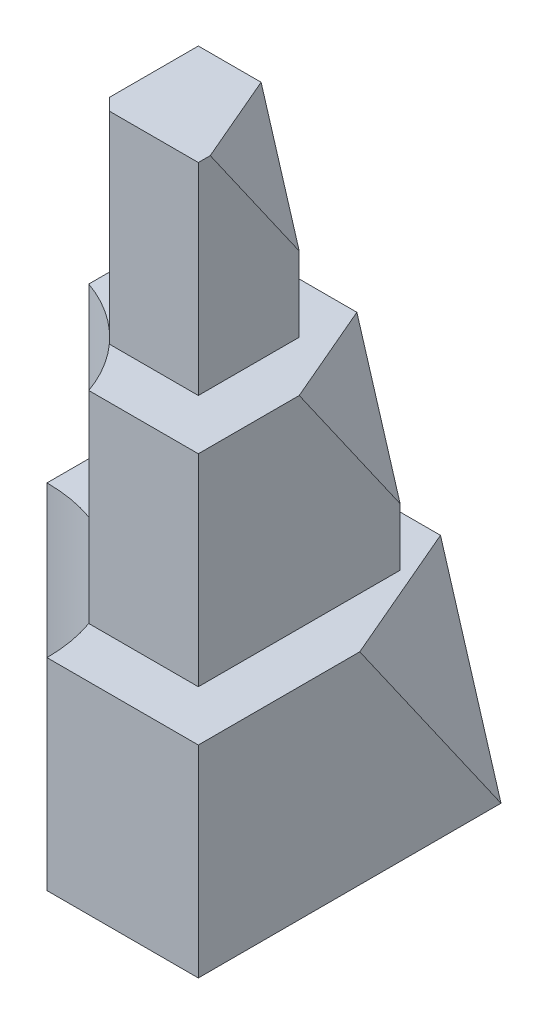
ISO-10303-21;
HEADER;
FILE_DESCRIPTION(('STEP AP214'),'2;1');
FILE_NAME('part.step','',(''),(''),'','','');
FILE_SCHEMA(('AUTOMOTIVE_DESIGN { 1 0 10303 214 1 1 1 1 }'));
ENDSEC;
DATA;
#1=APPLICATION_CONTEXT('core data for automotive mechanical design processes');
#2=APPLICATION_PROTOCOL_DEFINITION('international standard','automotive_design',2000,#1);
#3=PRODUCT_CONTEXT('',#1,'mechanical');
#4=PRODUCT('Part','Part','',(#3));
#5=PRODUCT_RELATED_PRODUCT_CATEGORY('part','',(#4));
#6=PRODUCT_DEFINITION_FORMATION('','',#4);
#7=PRODUCT_DEFINITION_CONTEXT('part definition',#1,'design');
#8=PRODUCT_DEFINITION('design','',#6,#7);
#9=PRODUCT_DEFINITION_SHAPE('','',#8);
#10=(LENGTH_UNIT() NAMED_UNIT(*) SI_UNIT(.MILLI.,.METRE.));
#11=(NAMED_UNIT(*) PLANE_ANGLE_UNIT() SI_UNIT($,.RADIAN.));
#12=(NAMED_UNIT(*) SI_UNIT($,.STERADIAN.) SOLID_ANGLE_UNIT());
#13=UNCERTAINTY_MEASURE_WITH_UNIT(LENGTH_MEASURE(1.E-05),#10,'distance_accuracy_value','');
#14=(GEOMETRIC_REPRESENTATION_CONTEXT(3) GLOBAL_UNCERTAINTY_ASSIGNED_CONTEXT((#13)) GLOBAL_UNIT_ASSIGNED_CONTEXT((#10,
#11,#12)) REPRESENTATION_CONTEXT('',''));
#15=CARTESIAN_POINT('',(0.,0.,0.));
#16=DIRECTION('',(0.,0.,1.));
#17=DIRECTION('',(1.,0.,0.));
#18=AXIS2_PLACEMENT_3D('',#15,#16,#17);
#19=CARTESIAN_POINT('',(0.,40.,0.));
#20=DIRECTION('',(0.,-1.,0.));
#21=DIRECTION('',(0.,0.,-1.));
#22=AXIS2_PLACEMENT_3D('',#19,#20,#21);
#23=PLANE('',#22);
#24=DIRECTION('',(-0.393919298579168,0.,-0.919145030018058));
#25=VECTOR('',#24,1.);
#26=CARTESIAN_POINT('',(10.,40.,0.));
#27=LINE('',#26,#25);
#28=CARTESIAN_POINT('',(10.,40.,0.));
#29=VERTEX_POINT('',#28);
#30=CARTESIAN_POINT('',(5.71428571428572,40.,-10.));
#31=VERTEX_POINT('',#30);
#32=EDGE_CURVE('E302',#29,#31,#27,.T.);
#33=ORIENTED_EDGE('',*,*,#32,.T.);
#34=DIRECTION('',(-1.,0.,0.));
#35=VECTOR('',#34,1.);
#36=CARTESIAN_POINT('',(-10.,40.,-10.));
#37=LINE('',#36,#35);
#38=CARTESIAN_POINT('',(-10.,40.,-10.));
#39=VERTEX_POINT('',#38);
#40=EDGE_CURVE('E464',#31,#39,#37,.T.);
#41=ORIENTED_EDGE('',*,*,#40,.T.);
#42=DIRECTION('',(0.,0.,1.));
#43=VECTOR('',#42,1.);
#44=CARTESIAN_POINT('',(-10.,40.,10.));
#45=LINE('',#44,#43);
#46=CARTESIAN_POINT('',(-10.,40.,0.857864376269045));
#47=VERTEX_POINT('',#46);
#48=EDGE_CURVE('E466',#39,#47,#45,.T.);
#49=ORIENTED_EDGE('',*,*,#48,.T.);
#50=CARTESIAN_POINT('',(-15.,40.,15.));
#51=DIRECTION('',(0.,-1.,0.));
#52=DIRECTION('',(0.,0.,-1.));
#53=AXIS2_PLACEMENT_3D('',#50,#51,#52);
#54=CIRCLE('',#53,15.);
#55=CARTESIAN_POINT('',(-5.,40.,3.81966011250105));
#56=VERTEX_POINT('',#55);
#57=EDGE_CURVE('E411',#56,#47,#54,.F.);
#58=ORIENTED_EDGE('',*,*,#57,.F.);
#59=DIRECTION('',(0.,0.,1.));
#60=VECTOR('',#59,1.);
#61=CARTESIAN_POINT('',(-5.,40.,5.));
#62=LINE('',#61,#60);
#63=CARTESIAN_POINT('',(-5.,40.,-5.));
#64=VERTEX_POINT('',#63);
#65=EDGE_CURVE('E206',#64,#56,#62,.T.);
#66=ORIENTED_EDGE('',*,*,#65,.F.);
#67=DIRECTION('',(-1.,0.,0.));
#68=VECTOR('',#67,1.);
#69=CARTESIAN_POINT('',(-5.,40.,-5.));
#70=LINE('',#69,#68);
#71=CARTESIAN_POINT('',(5.,40.,-5.));
#72=VERTEX_POINT('',#71);
#73=EDGE_CURVE('E227',#72,#64,#70,.T.);
#74=ORIENTED_EDGE('',*,*,#73,.F.);
#75=DIRECTION('',(0.,0.,-1.));
#76=VECTOR('',#75,1.);
#77=CARTESIAN_POINT('',(5.,40.,5.));
#78=LINE('',#77,#76);
#79=CARTESIAN_POINT('',(5.,40.,5.));
#80=VERTEX_POINT('',#79);
#81=EDGE_CURVE('E225',#80,#72,#78,.T.);
#82=ORIENTED_EDGE('',*,*,#81,.F.);
#83=DIRECTION('',(1.,0.,0.));
#84=VECTOR('',#83,1.);
#85=CARTESIAN_POINT('',(-5.,40.,5.));
#86=LINE('',#85,#84);
#87=CARTESIAN_POINT('',(-3.81966011250105,40.,5.));
#88=VERTEX_POINT('',#87);
#89=EDGE_CURVE('E202',#88,#80,#86,.T.);
#90=ORIENTED_EDGE('',*,*,#89,.F.);
#91=CARTESIAN_POINT('',(-0.857864376269047,40.,10.));
#92=VERTEX_POINT('',#91);
#93=EDGE_CURVE('E418',#92,#88,#54,.F.);
#94=ORIENTED_EDGE('',*,*,#93,.F.);
#95=DIRECTION('',(1.,0.,0.));
#96=VECTOR('',#95,1.);
#97=CARTESIAN_POINT('',(-10.,40.,10.));
#98=LINE('',#97,#96);
#99=CARTESIAN_POINT('',(10.,40.,10.));
#100=VERTEX_POINT('',#99);
#101=EDGE_CURVE('E473',#92,#100,#98,.T.);
#102=ORIENTED_EDGE('',*,*,#101,.T.);
#103=DIRECTION('',(0.,0.,-1.));
#104=VECTOR('',#103,1.);
#105=CARTESIAN_POINT('',(10.,40.,10.));
#106=LINE('',#105,#104);
#107=EDGE_CURVE('E467',#100,#29,#106,.T.);
#108=ORIENTED_EDGE('',*,*,#107,.T.);
#109=EDGE_LOOP('',(#33,#41,#49,#58,#66,#74,#82,#90,#94,#102,#108));
#110=FACE_BOUND('',#109,.T.);
#111=ADVANCED_FACE('F52',(#110),#23,.F.);
#112=CARTESIAN_POINT('',(10.,40.,10.));
#113=DIRECTION('',(-1.,0.,0.));
#114=DIRECTION('',(0.,0.,1.));
#115=AXIS2_PLACEMENT_3D('',#112,#113,#114);
#116=PLANE('',#115);
#117=DIRECTION('',(0.,0.81923192051904,0.573462344363329));
#118=VECTOR('',#117,1.);
#119=CARTESIAN_POINT('',(10.,40.,0.));
#120=LINE('',#119,#118);
#121=CARTESIAN_POINT('',(10.,25.7142857142857,-10.));
#122=VERTEX_POINT('',#121);
#123=EDGE_CURVE('E80',#122,#29,#120,.T.);
#124=ORIENTED_EDGE('',*,*,#123,.T.);
#125=ORIENTED_EDGE('',*,*,#107,.F.);
#126=DIRECTION('',(0.,-1.,0.));
#127=VECTOR('',#126,1.);
#128=CARTESIAN_POINT('',(10.,40.,10.));
#129=LINE('',#128,#127);
#130=CARTESIAN_POINT('',(10.,20.,10.));
#131=VERTEX_POINT('',#130);
#132=EDGE_CURVE('E475',#100,#131,#129,.T.);
#133=ORIENTED_EDGE('',*,*,#132,.T.);
#134=DIRECTION('',(0.,0.,-1.));
#135=VECTOR('',#134,1.);
#136=CARTESIAN_POINT('',(10.,20.,10.));
#137=LINE('',#136,#135);
#138=CARTESIAN_POINT('',(10.,20.,-10.));
#139=VERTEX_POINT('',#138);
#140=EDGE_CURVE('E241',#131,#139,#137,.T.);
#141=ORIENTED_EDGE('',*,*,#140,.T.);
#142=DIRECTION('',(0.,-1.,0.));
#143=VECTOR('',#142,1.);
#144=CARTESIAN_POINT('',(10.,40.,-10.));
#145=LINE('',#144,#143);
#146=EDGE_CURVE('E367',#122,#139,#145,.T.);
#147=ORIENTED_EDGE('',*,*,#146,.F.);
#148=EDGE_LOOP('',(#124,#125,#133,#141,#147));
#149=FACE_BOUND('',#148,.T.);
#150=ADVANCED_FACE('F313',(#149),#116,.F.);
#151=CARTESIAN_POINT('',(-10.,40.,-10.));
#152=DIRECTION('',(0.,0.,1.));
#153=DIRECTION('',(1.,0.,0.));
#154=AXIS2_PLACEMENT_3D('',#151,#152,#153);
#155=PLANE('',#154);
#156=DIRECTION('',(0.287347885566346,-0.957826285221151,0.));
#157=VECTOR('',#156,1.);
#158=CARTESIAN_POINT('',(5.71428571428572,40.,-10.));
#159=LINE('',#158,#157);
#160=EDGE_CURVE('E210',#31,#122,#159,.T.);
#161=ORIENTED_EDGE('',*,*,#160,.T.);
#162=ORIENTED_EDGE('',*,*,#146,.T.);
#163=DIRECTION('',(-1.,0.,0.));
#164=VECTOR('',#163,1.);
#165=CARTESIAN_POINT('',(-10.,20.,-10.));
#166=LINE('',#165,#164);
#167=CARTESIAN_POINT('',(-10.,20.,-10.));
#168=VERTEX_POINT('',#167);
#169=EDGE_CURVE('E478',#139,#168,#166,.T.);
#170=ORIENTED_EDGE('',*,*,#169,.T.);
#171=DIRECTION('',(0.,-1.,0.));
#172=VECTOR('',#171,1.);
#173=CARTESIAN_POINT('',(-10.,40.,-10.));
#174=LINE('',#173,#172);
#175=EDGE_CURVE('E486',#39,#168,#174,.T.);
#176=ORIENTED_EDGE('',*,*,#175,.F.);
#177=ORIENTED_EDGE('',*,*,#40,.F.);
#178=EDGE_LOOP('',(#161,#162,#170,#176,#177));
#179=FACE_BOUND('',#178,.T.);
#180=ADVANCED_FACE('F323',(#179),#155,.F.);
#181=CARTESIAN_POINT('',(0.,20.,0.));
#182=DIRECTION('',(0.,-1.,0.));
#183=DIRECTION('',(0.,0.,-1.));
#184=AXIS2_PLACEMENT_3D('',#181,#182,#183);
#185=PLANE('',#184);
#186=DIRECTION('',(-0.393919298579168,0.,-0.919145030018058));
#187=VECTOR('',#186,1.);
#188=CARTESIAN_POINT('',(9.,20.,-15.));
#189=LINE('',#188,#187);
#190=CARTESIAN_POINT('',(15.,20.,-1.));
#191=VERTEX_POINT('',#190);
#192=CARTESIAN_POINT('',(9.,20.,-15.));
#193=VERTEX_POINT('',#192);
#194=EDGE_CURVE('E427',#191,#193,#189,.T.);
#195=ORIENTED_EDGE('',*,*,#194,.T.);
#196=DIRECTION('',(-1.,0.,0.));
#197=VECTOR('',#196,1.);
#198=CARTESIAN_POINT('',(-15.,20.,-15.));
#199=LINE('',#198,#197);
#200=CARTESIAN_POINT('',(-15.,20.,-15.));
#201=VERTEX_POINT('',#200);
#202=EDGE_CURVE('E374',#193,#201,#199,.T.);
#203=ORIENTED_EDGE('',*,*,#202,.T.);
#204=DIRECTION('',(0.,0.,1.));
#205=VECTOR('',#204,1.);
#206=CARTESIAN_POINT('',(-15.,20.,15.));
#207=LINE('',#206,#205);
#208=CARTESIAN_POINT('',(-15.,20.,0.));
#209=VERTEX_POINT('',#208);
#210=EDGE_CURVE('E385',#201,#209,#207,.T.);
#211=ORIENTED_EDGE('',*,*,#210,.T.);
#212=CARTESIAN_POINT('',(-15.,20.,15.));
#213=DIRECTION('',(0.,-1.,0.));
#214=DIRECTION('',(0.,0.,-1.));
#215=AXIS2_PLACEMENT_3D('',#212,#213,#214);
#216=CIRCLE('',#215,15.);
#217=CARTESIAN_POINT('',(-10.,20.,0.857864376269045));
#218=VERTEX_POINT('',#217);
#219=EDGE_CURVE('E400',#218,#209,#216,.F.);
#220=ORIENTED_EDGE('',*,*,#219,.F.);
#221=DIRECTION('',(0.,0.,1.));
#222=VECTOR('',#221,1.);
#223=CARTESIAN_POINT('',(-10.,20.,10.));
#224=LINE('',#223,#222);
#225=EDGE_CURVE('E481',#168,#218,#224,.T.);
#226=ORIENTED_EDGE('',*,*,#225,.F.);
#227=ORIENTED_EDGE('',*,*,#169,.F.);
#228=ORIENTED_EDGE('',*,*,#140,.F.);
#229=DIRECTION('',(1.,0.,0.));
#230=VECTOR('',#229,1.);
#231=CARTESIAN_POINT('',(-10.,20.,10.));
#232=LINE('',#231,#230);
#233=CARTESIAN_POINT('',(-0.857864376269047,20.,10.));
#234=VERTEX_POINT('',#233);
#235=EDGE_CURVE('E483',#234,#131,#232,.T.);
#236=ORIENTED_EDGE('',*,*,#235,.F.);
#237=CARTESIAN_POINT('',(0.,20.,15.));
#238=VERTEX_POINT('',#237);
#239=EDGE_CURVE('E410',#238,#234,#216,.F.);
#240=ORIENTED_EDGE('',*,*,#239,.F.);
#241=DIRECTION('',(1.,0.,0.));
#242=VECTOR('',#241,1.);
#243=CARTESIAN_POINT('',(-15.,20.,15.));
#244=LINE('',#243,#242);
#245=CARTESIAN_POINT('',(15.,20.,15.));
#246=VERTEX_POINT('',#245);
#247=EDGE_CURVE('E390',#238,#246,#244,.T.);
#248=ORIENTED_EDGE('',*,*,#247,.T.);
#249=DIRECTION('',(0.,0.,-1.));
#250=VECTOR('',#249,1.);
#251=CARTESIAN_POINT('',(15.,20.,15.));
#252=LINE('',#251,#250);
#253=EDGE_CURVE('E370',#246,#191,#252,.T.);
#254=ORIENTED_EDGE('',*,*,#253,.T.);
#255=EDGE_LOOP('',(#195,#203,#211,#220,#226,#227,#228,#236,#240,#248,#254));
#256=FACE_BOUND('',#255,.T.);
#257=ADVANCED_FACE('F327',(#256),#185,.F.);
#258=CARTESIAN_POINT('',(15.,20.,15.));
#259=DIRECTION('',(-1.,0.,0.));
#260=DIRECTION('',(0.,0.,1.));
#261=AXIS2_PLACEMENT_3D('',#258,#259,#260);
#262=PLANE('',#261);
#263=DIRECTION('',(0.,0.819231920519041,0.573462344363328));
#264=VECTOR('',#263,1.);
#265=CARTESIAN_POINT('',(15.,0.,-15.));
#266=LINE('',#265,#264);
#267=CARTESIAN_POINT('',(15.,0.,-15.));
#268=VERTEX_POINT('',#267);
#269=EDGE_CURVE('E455',#268,#191,#266,.T.);
#270=ORIENTED_EDGE('',*,*,#269,.T.);
#271=ORIENTED_EDGE('',*,*,#253,.F.);
#272=DIRECTION('',(0.,-1.,0.));
#273=VECTOR('',#272,1.);
#274=CARTESIAN_POINT('',(15.,20.,15.));
#275=LINE('',#274,#273);
#276=CARTESIAN_POINT('',(15.,0.,15.));
#277=VERTEX_POINT('',#276);
#278=EDGE_CURVE('E63',#246,#277,#275,.T.);
#279=ORIENTED_EDGE('',*,*,#278,.T.);
#280=DIRECTION('',(0.,0.,-1.));
#281=VECTOR('',#280,1.);
#282=CARTESIAN_POINT('',(15.,0.,15.));
#283=LINE('',#282,#281);
#284=EDGE_CURVE('E362',#277,#268,#283,.T.);
#285=ORIENTED_EDGE('',*,*,#284,.T.);
#286=EDGE_LOOP('',(#270,#271,#279,#285));
#287=FACE_BOUND('',#286,.T.);
#288=ADVANCED_FACE('F54',(#287),#262,.F.);
#289=CARTESIAN_POINT('',(-15.,20.,-15.));
#290=DIRECTION('',(0.,0.,1.));
#291=DIRECTION('',(1.,0.,0.));
#292=AXIS2_PLACEMENT_3D('',#289,#290,#291);
#293=PLANE('',#292);
#294=DIRECTION('',(0.287347885566345,-0.957826285221151,0.));
#295=VECTOR('',#294,1.);
#296=CARTESIAN_POINT('',(9.,20.,-15.));
#297=LINE('',#296,#295);
#298=EDGE_CURVE('E307',#193,#268,#297,.T.);
#299=ORIENTED_EDGE('',*,*,#298,.T.);
#300=DIRECTION('',(-1.,0.,0.));
#301=VECTOR('',#300,1.);
#302=CARTESIAN_POINT('',(-15.,0.,-15.));
#303=LINE('',#302,#301);
#304=CARTESIAN_POINT('',(-15.,0.,-15.));
#305=VERTEX_POINT('',#304);
#306=EDGE_CURVE('E354',#268,#305,#303,.T.);
#307=ORIENTED_EDGE('',*,*,#306,.T.);
#308=DIRECTION('',(0.,-1.,0.));
#309=VECTOR('',#308,1.);
#310=CARTESIAN_POINT('',(-15.,20.,-15.));
#311=LINE('',#310,#309);
#312=EDGE_CURVE('E12',#201,#305,#311,.T.);
#313=ORIENTED_EDGE('',*,*,#312,.F.);
#314=ORIENTED_EDGE('',*,*,#202,.F.);
#315=EDGE_LOOP('',(#299,#307,#313,#314));
#316=FACE_BOUND('',#315,.T.);
#317=ADVANCED_FACE('F342',(#316),#293,.F.);
#318=CARTESIAN_POINT('',(-15.,20.,15.));
#319=DIRECTION('',(1.,0.,0.));
#320=DIRECTION('',(0.,0.,-1.));
#321=AXIS2_PLACEMENT_3D('',#318,#319,#320);
#322=PLANE('',#321);
#323=DIRECTION('',(0.,-1.,0.));
#324=VECTOR('',#323,1.);
#325=CARTESIAN_POINT('',(-15.,60.,0.));
#326=LINE('',#325,#324);
#327=CARTESIAN_POINT('',(-15.,0.,0.));
#328=VERTEX_POINT('',#327);
#329=EDGE_CURVE('E217',#209,#328,#326,.T.);
#330=ORIENTED_EDGE('',*,*,#329,.F.);
#331=ORIENTED_EDGE('',*,*,#210,.F.);
#332=ORIENTED_EDGE('',*,*,#312,.T.);
#333=DIRECTION('',(0.,0.,1.));
#334=VECTOR('',#333,1.);
#335=CARTESIAN_POINT('',(-15.,0.,15.));
#336=LINE('',#335,#334);
#337=EDGE_CURVE('E361',#305,#328,#336,.T.);
#338=ORIENTED_EDGE('',*,*,#337,.T.);
#339=EDGE_LOOP('',(#330,#331,#332,#338));
#340=FACE_BOUND('',#339,.T.);
#341=ADVANCED_FACE('F339',(#340),#322,.F.);
#342=CARTESIAN_POINT('',(-15.,20.,15.));
#343=DIRECTION('',(0.,0.,-1.));
#344=DIRECTION('',(-1.,0.,0.));
#345=AXIS2_PLACEMENT_3D('',#342,#343,#344);
#346=PLANE('',#345);
#347=DIRECTION('',(0.,-1.,0.));
#348=VECTOR('',#347,1.);
#349=CARTESIAN_POINT('',(0.,60.,15.));
#350=LINE('',#349,#348);
#351=CARTESIAN_POINT('',(0.,0.,15.));
#352=VERTEX_POINT('',#351);
#353=EDGE_CURVE('E414',#352,#238,#350,.F.);
#354=ORIENTED_EDGE('',*,*,#353,.F.);
#355=DIRECTION('',(1.,0.,0.));
#356=VECTOR('',#355,1.);
#357=CARTESIAN_POINT('',(-15.,0.,15.));
#358=LINE('',#357,#356);
#359=EDGE_CURVE('E375',#352,#277,#358,.T.);
#360=ORIENTED_EDGE('',*,*,#359,.T.);
#361=ORIENTED_EDGE('',*,*,#278,.F.);
#362=ORIENTED_EDGE('',*,*,#247,.F.);
#363=EDGE_LOOP('',(#354,#360,#361,#362));
#364=FACE_BOUND('',#363,.T.);
#365=ADVANCED_FACE('F335',(#364),#346,.F.);
#366=CARTESIAN_POINT('',(-10.,40.,10.));
#367=DIRECTION('',(1.,0.,0.));
#368=DIRECTION('',(0.,0.,-1.));
#369=AXIS2_PLACEMENT_3D('',#366,#367,#368);
#370=PLANE('',#369);
#371=DIRECTION('',(0.,-1.,0.));
#372=VECTOR('',#371,1.);
#373=CARTESIAN_POINT('',(-10.,60.,0.857864376269045));
#374=LINE('',#373,#372);
#375=EDGE_CURVE('E408',#47,#218,#374,.T.);
#376=ORIENTED_EDGE('',*,*,#375,.F.);
#377=ORIENTED_EDGE('',*,*,#48,.F.);
#378=ORIENTED_EDGE('',*,*,#175,.T.);
#379=ORIENTED_EDGE('',*,*,#225,.T.);
#380=EDGE_LOOP('',(#376,#377,#378,#379));
#381=FACE_BOUND('',#380,.T.);
#382=ADVANCED_FACE('F338',(#381),#370,.F.);
#383=CARTESIAN_POINT('',(-10.,40.,10.));
#384=DIRECTION('',(0.,0.,-1.));
#385=DIRECTION('',(-1.,0.,0.));
#386=AXIS2_PLACEMENT_3D('',#383,#384,#385);
#387=PLANE('',#386);
#388=DIRECTION('',(0.,-1.,0.));
#389=VECTOR('',#388,1.);
#390=CARTESIAN_POINT('',(-0.857864376269047,60.,10.));
#391=LINE('',#390,#389);
#392=EDGE_CURVE('E415',#234,#92,#391,.F.);
#393=ORIENTED_EDGE('',*,*,#392,.F.);
#394=ORIENTED_EDGE('',*,*,#235,.T.);
#395=ORIENTED_EDGE('',*,*,#132,.F.);
#396=ORIENTED_EDGE('',*,*,#101,.F.);
#397=EDGE_LOOP('',(#393,#394,#395,#396));
#398=FACE_BOUND('',#397,.T.);
#399=ADVANCED_FACE('F502',(#398),#387,.F.);
#400=CARTESIAN_POINT('',(-5.,60.,5.));
#401=DIRECTION('',(1.,0.,0.));
#402=DIRECTION('',(0.,0.,-1.));
#403=AXIS2_PLACEMENT_3D('',#400,#401,#402);
#404=PLANE('',#403);
#405=DIRECTION('',(0.,-1.,0.));
#406=VECTOR('',#405,1.);
#407=CARTESIAN_POINT('',(-5.,60.,3.81966011250105));
#408=LINE('',#407,#406);
#409=CARTESIAN_POINT('',(-5.,60.,3.81966011250105));
#410=VERTEX_POINT('',#409);
#411=EDGE_CURVE('E417',#410,#56,#408,.T.);
#412=ORIENTED_EDGE('',*,*,#411,.F.);
#413=DIRECTION('',(0.,0.,1.));
#414=VECTOR('',#413,1.);
#415=CARTESIAN_POINT('',(-5.,60.,5.));
#416=LINE('',#415,#414);
#417=CARTESIAN_POINT('',(-5.,60.,-5.));
#418=VERTEX_POINT('',#417);
#419=EDGE_CURVE('E204',#418,#410,#416,.T.);
#420=ORIENTED_EDGE('',*,*,#419,.F.);
#421=DIRECTION('',(0.,-1.,0.));
#422=VECTOR('',#421,1.);
#423=CARTESIAN_POINT('',(-5.,60.,-5.));
#424=LINE('',#423,#422);
#425=EDGE_CURVE('E233',#418,#64,#424,.T.);
#426=ORIENTED_EDGE('',*,*,#425,.T.);
#427=ORIENTED_EDGE('',*,*,#65,.T.);
#428=EDGE_LOOP('',(#412,#420,#426,#427));
#429=FACE_BOUND('',#428,.T.);
#430=ADVANCED_FACE('F256',(#429),#404,.F.);
#431=CARTESIAN_POINT('',(-5.,60.,5.));
#432=DIRECTION('',(0.,0.,-1.));
#433=DIRECTION('',(-1.,0.,0.));
#434=AXIS2_PLACEMENT_3D('',#431,#432,#433);
#435=PLANE('',#434);
#436=DIRECTION('',(0.,-1.,0.));
#437=VECTOR('',#436,1.);
#438=CARTESIAN_POINT('',(-3.81966011250105,60.,5.));
#439=LINE('',#438,#437);
#440=CARTESIAN_POINT('',(-3.81966011250105,60.,5.));
#441=VERTEX_POINT('',#440);
#442=EDGE_CURVE('E420',#88,#441,#439,.F.);
#443=ORIENTED_EDGE('',*,*,#442,.F.);
#444=ORIENTED_EDGE('',*,*,#89,.T.);
#445=DIRECTION('',(0.,-1.,0.));
#446=VECTOR('',#445,1.);
#447=CARTESIAN_POINT('',(5.,60.,5.));
#448=LINE('',#447,#446);
#449=CARTESIAN_POINT('',(5.,60.,5.));
#450=VERTEX_POINT('',#449);
#451=EDGE_CURVE('E224',#450,#80,#448,.T.);
#452=ORIENTED_EDGE('',*,*,#451,.F.);
#453=DIRECTION('',(1.,0.,0.));
#454=VECTOR('',#453,1.);
#455=CARTESIAN_POINT('',(-5.,60.,5.));
#456=LINE('',#455,#454);
#457=EDGE_CURVE('E199',#441,#450,#456,.T.);
#458=ORIENTED_EDGE('',*,*,#457,.F.);
#459=EDGE_LOOP('',(#443,#444,#452,#458));
#460=FACE_BOUND('',#459,.T.);
#461=ADVANCED_FACE('F333',(#460),#435,.F.);
#462=CARTESIAN_POINT('',(0.,0.,0.));
#463=DIRECTION('',(0.,-1.,0.));
#464=DIRECTION('',(0.,0.,-1.));
#465=AXIS2_PLACEMENT_3D('',#462,#463,#464);
#466=PLANE('',#465);
#467=ORIENTED_EDGE('',*,*,#359,.F.);
#468=CARTESIAN_POINT('',(-15.,0.,15.));
#469=DIRECTION('',(0.,1.,0.));
#470=DIRECTION('',(0.,0.,1.));
#471=AXIS2_PLACEMENT_3D('',#468,#469,#470);
#472=CIRCLE('',#471,15.);
#473=EDGE_CURVE('E425',#352,#328,#472,.T.);
#474=ORIENTED_EDGE('',*,*,#473,.T.);
#475=ORIENTED_EDGE('',*,*,#337,.F.);
#476=ORIENTED_EDGE('',*,*,#306,.F.);
#477=ORIENTED_EDGE('',*,*,#284,.F.);
#478=EDGE_LOOP('',(#467,#474,#475,#476,#477));
#479=FACE_BOUND('',#478,.T.);
#480=ADVANCED_FACE('F261',(#479),#466,.T.);
#481=CARTESIAN_POINT('',(5.,60.,5.));
#482=DIRECTION('',(-1.,0.,0.));
#483=DIRECTION('',(0.,0.,1.));
#484=AXIS2_PLACEMENT_3D('',#481,#482,#483);
#485=PLANE('',#484);
#486=DIRECTION('',(0.,-1.,0.));
#487=VECTOR('',#486,1.);
#488=CARTESIAN_POINT('',(5.,60.,-5.));
#489=LINE('',#488,#487);
#490=CARTESIAN_POINT('',(5.,47.4004855535699,-5.));
#491=VERTEX_POINT('',#490);
#492=EDGE_CURVE('E193',#491,#72,#489,.T.);
#493=ORIENTED_EDGE('',*,*,#492,.F.);
#494=DIRECTION('',(0.,-0.81923192051904,-0.573462344363329));
#495=VECTOR('',#494,1.);
#496=CARTESIAN_POINT('',(5.,60.,3.81966011250105));
#497=LINE('',#496,#495);
#498=CARTESIAN_POINT('',(5.,60.,3.81966011250105));
#499=VERTEX_POINT('',#498);
#500=EDGE_CURVE('E57',#499,#491,#497,.T.);
#501=ORIENTED_EDGE('',*,*,#500,.F.);
#502=DIRECTION('',(0.,0.,-1.));
#503=VECTOR('',#502,1.);
#504=CARTESIAN_POINT('',(5.,60.,5.));
#505=LINE('',#504,#503);
#506=EDGE_CURVE('E191',#450,#499,#505,.T.);
#507=ORIENTED_EDGE('',*,*,#506,.F.);
#508=ORIENTED_EDGE('',*,*,#451,.T.);
#509=ORIENTED_EDGE('',*,*,#81,.T.);
#510=EDGE_LOOP('',(#493,#501,#507,#508,#509));
#511=FACE_BOUND('',#510,.T.);
#512=ADVANCED_FACE('F189',(#511),#485,.F.);
#513=CARTESIAN_POINT('',(-5.,60.,-5.));
#514=DIRECTION('',(0.,0.,1.));
#515=DIRECTION('',(1.,0.,0.));
#516=AXIS2_PLACEMENT_3D('',#513,#514,#515);
#517=PLANE('',#516);
#518=DIRECTION('',(-1.,0.,0.));
#519=VECTOR('',#518,1.);
#520=CARTESIAN_POINT('',(-5.,60.,-5.));
#521=LINE('',#520,#519);
#522=CARTESIAN_POINT('',(1.22014566607098,60.,-5.));
#523=VERTEX_POINT('',#522);
#524=EDGE_CURVE('E201',#523,#418,#521,.T.);
#525=ORIENTED_EDGE('',*,*,#524,.F.);
#526=DIRECTION('',(-0.287347885566346,0.957826285221151,0.));
#527=VECTOR('',#526,1.);
#528=CARTESIAN_POINT('',(5.,47.4004855535699,-5.));
#529=LINE('',#528,#527);
#530=EDGE_CURVE('E71',#491,#523,#529,.T.);
#531=ORIENTED_EDGE('',*,*,#530,.F.);
#532=ORIENTED_EDGE('',*,*,#492,.T.);
#533=ORIENTED_EDGE('',*,*,#73,.T.);
#534=ORIENTED_EDGE('',*,*,#425,.F.);
#535=EDGE_LOOP('',(#525,#531,#532,#533,#534));
#536=FACE_BOUND('',#535,.T.);
#537=ADVANCED_FACE('F246',(#536),#517,.F.);
#538=CARTESIAN_POINT('',(0.,60.,0.));
#539=DIRECTION('',(0.,-1.,0.));
#540=DIRECTION('',(0.,0.,-1.));
#541=AXIS2_PLACEMENT_3D('',#538,#539,#540);
#542=PLANE('',#541);
#543=ORIENTED_EDGE('',*,*,#506,.T.);
#544=DIRECTION('',(0.393919298579168,0.,0.919145030018058));
#545=VECTOR('',#544,1.);
#546=CARTESIAN_POINT('',(1.22014566607098,60.,-5.));
#547=LINE('',#546,#545);
#548=EDGE_CURVE('E177',#523,#499,#547,.T.);
#549=ORIENTED_EDGE('',*,*,#548,.F.);
#550=ORIENTED_EDGE('',*,*,#524,.T.);
#551=ORIENTED_EDGE('',*,*,#419,.T.);
#552=CARTESIAN_POINT('',(-15.,60.,15.));
#553=DIRECTION('',(0.,1.,0.));
#554=DIRECTION('',(0.,0.,1.));
#555=AXIS2_PLACEMENT_3D('',#552,#553,#554);
#556=CIRCLE('',#555,15.);
#557=EDGE_CURVE('E424',#441,#410,#556,.T.);
#558=ORIENTED_EDGE('',*,*,#557,.F.);
#559=ORIENTED_EDGE('',*,*,#457,.T.);
#560=EDGE_LOOP('',(#543,#549,#550,#551,#558,#559));
#561=FACE_BOUND('',#560,.T.);
#562=ADVANCED_FACE('F196',(#561),#542,.F.);
#563=CARTESIAN_POINT('',(-15.,60.,15.));
#564=DIRECTION('',(0.,-1.,0.));
#565=DIRECTION('',(0.,0.,-1.));
#566=AXIS2_PLACEMENT_3D('',#563,#564,#565);
#567=CYLINDRICAL_SURFACE('',#566,15.);
#568=ORIENTED_EDGE('',*,*,#329,.T.);
#569=ORIENTED_EDGE('',*,*,#473,.F.);
#570=ORIENTED_EDGE('',*,*,#353,.T.);
#571=ORIENTED_EDGE('',*,*,#239,.T.);
#572=ORIENTED_EDGE('',*,*,#392,.T.);
#573=ORIENTED_EDGE('',*,*,#93,.T.);
#574=ORIENTED_EDGE('',*,*,#442,.T.);
#575=ORIENTED_EDGE('',*,*,#557,.T.);
#576=ORIENTED_EDGE('',*,*,#411,.T.);
#577=ORIENTED_EDGE('',*,*,#57,.T.);
#578=ORIENTED_EDGE('',*,*,#375,.T.);
#579=ORIENTED_EDGE('',*,*,#219,.T.);
#580=EDGE_LOOP('',(#568,#569,#570,#571,#572,#573,#574,#575,#576,#577,#578,#579));
#581=FACE_BOUND('',#580,.T.);
#582=ADVANCED_FACE('F442',(#581),#567,.F.);
#583=CARTESIAN_POINT('',(16.8242268867169,5.04726806601506,-7.21038295145009));
#584=DIRECTION('',(0.886075949367089,0.265822784810127,-0.379746835443038));
#585=DIRECTION('',(-0.393919298579168,0.,-0.919145030018058));
#586=AXIS2_PLACEMENT_3D('',#583,#584,#585);
#587=PLANE('',#586);
#588=ORIENTED_EDGE('',*,*,#298,.F.);
#589=ORIENTED_EDGE('',*,*,#194,.F.);
#590=ORIENTED_EDGE('',*,*,#269,.F.);
#591=EDGE_LOOP('',(#588,#589,#590));
#592=FACE_BOUND('',#591,.T.);
#593=ADVANCED_FACE('F433',(#592),#587,.T.);
#594=CARTESIAN_POINT('',(17.2728729370293,5.1818618811088,-7.40265983015542));
#595=DIRECTION('',(0.886075949367089,0.265822784810127,-0.379746835443038));
#596=DIRECTION('',(-0.393919298579168,0.,-0.919145030018058));
#597=AXIS2_PLACEMENT_3D('',#594,#595,#596);
#598=PLANE('',#597);
#599=ORIENTED_EDGE('',*,*,#160,.F.);
#600=ORIENTED_EDGE('',*,*,#32,.F.);
#601=ORIENTED_EDGE('',*,*,#123,.F.);
#602=EDGE_LOOP('',(#599,#600,#601));
#603=FACE_BOUND('',#602,.T.);
#604=ADVANCED_FACE('F286',(#603),#598,.T.);
#605=CARTESIAN_POINT('',(16.7727469578189,5.03182408734567,-7.18832012477953));
#606=DIRECTION('',(-0.886075949367089,-0.265822784810127,0.379746835443038));
#607=DIRECTION('',(0.393919298579168,0.,0.919145030018058));
#608=AXIS2_PLACEMENT_3D('',#605,#606,#607);
#609=PLANE('',#608);
#610=ORIENTED_EDGE('',*,*,#548,.T.);
#611=ORIENTED_EDGE('',*,*,#500,.T.);
#612=ORIENTED_EDGE('',*,*,#530,.T.);
#613=EDGE_LOOP('',(#610,#611,#612));
#614=FACE_BOUND('',#613,.T.);
#615=ADVANCED_FACE('F179',(#614),#609,.F.);
#616=CLOSED_SHELL('',(#111,#150,#180,#257,#288,#317,#341,#365,#382,#399,#430,#461,#480,#512,
#537,#562,#582,#593,#604,#615));
#617=MANIFOLD_SOLID_BREP('B2',#616);
#618=ADVANCED_BREP_SHAPE_REPRESENTATION('',(#18,#617),#14);
#619=SHAPE_DEFINITION_REPRESENTATION(#9,#618);
ENDSEC;
END-ISO-10303-21;
